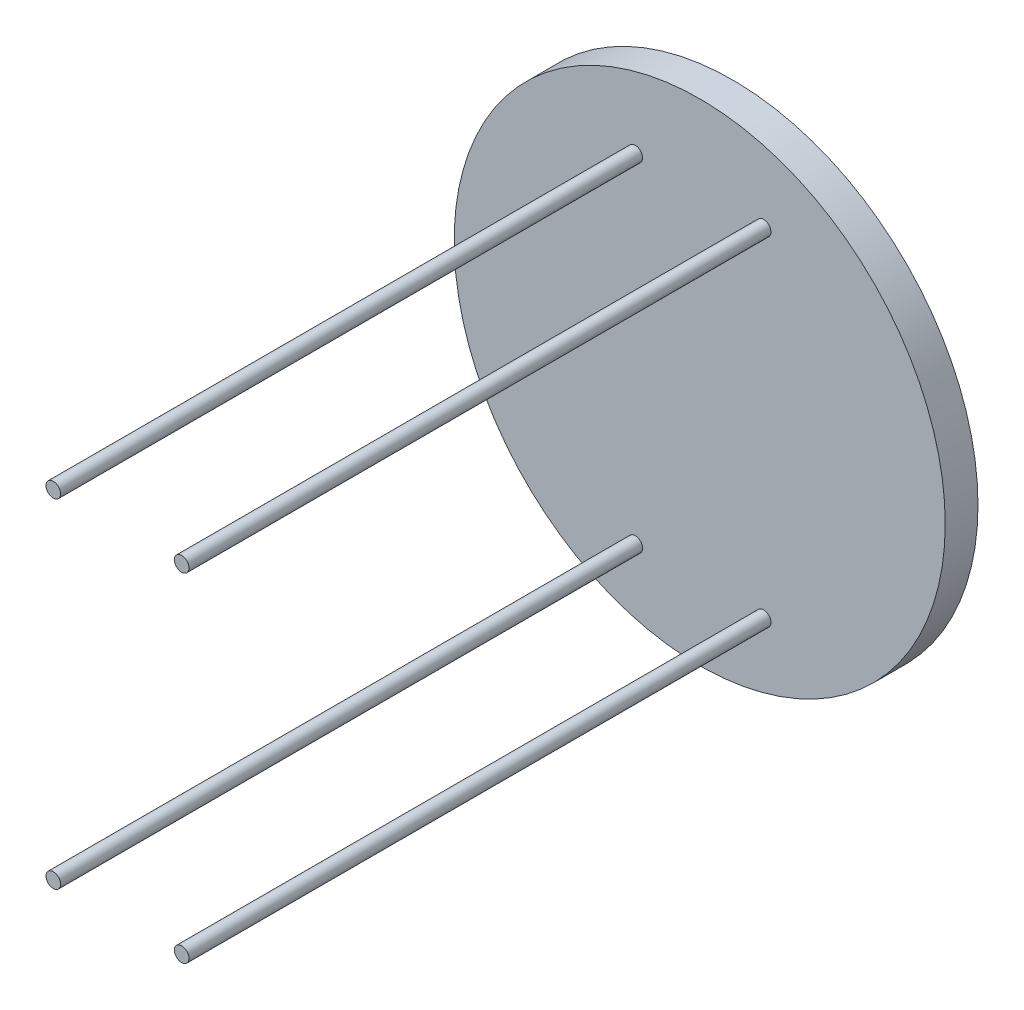
ISO-10303-21;
HEADER;
FILE_DESCRIPTION(('STEP AP214'),'2;1');
FILE_NAME('part.step','',(''),(''),'','','');
FILE_SCHEMA(('AUTOMOTIVE_DESIGN { 1 0 10303 214 1 1 1 1 }'));
ENDSEC;
DATA;
#1=APPLICATION_CONTEXT('core data for automotive mechanical design processes');
#2=APPLICATION_PROTOCOL_DEFINITION('international standard','automotive_design',2000,#1);
#3=PRODUCT_CONTEXT('',#1,'mechanical');
#4=PRODUCT('Part','Part','',(#3));
#5=PRODUCT_RELATED_PRODUCT_CATEGORY('part','',(#4));
#6=PRODUCT_DEFINITION_FORMATION('','',#4);
#7=PRODUCT_DEFINITION_CONTEXT('part definition',#1,'design');
#8=PRODUCT_DEFINITION('design','',#6,#7);
#9=PRODUCT_DEFINITION_SHAPE('','',#8);
#10=(LENGTH_UNIT() NAMED_UNIT(*) SI_UNIT(.MILLI.,.METRE.));
#11=(NAMED_UNIT(*) PLANE_ANGLE_UNIT() SI_UNIT($,.RADIAN.));
#12=(NAMED_UNIT(*) SI_UNIT($,.STERADIAN.) SOLID_ANGLE_UNIT());
#13=UNCERTAINTY_MEASURE_WITH_UNIT(LENGTH_MEASURE(1.E-05),#10,'distance_accuracy_value','');
#14=(GEOMETRIC_REPRESENTATION_CONTEXT(3) GLOBAL_UNCERTAINTY_ASSIGNED_CONTEXT((#13)) GLOBAL_UNIT_ASSIGNED_CONTEXT((#10,
#11,#12)) REPRESENTATION_CONTEXT('',''));
#15=CARTESIAN_POINT('',(0.,0.,0.));
#16=DIRECTION('',(0.,0.,1.));
#17=DIRECTION('',(1.,0.,0.));
#18=AXIS2_PLACEMENT_3D('',#15,#16,#17);
#19=CARTESIAN_POINT('',(833.930631375601,-1197.16637306014,769.51077616825));
#20=DIRECTION('',(0.,0.,1.));
#21=DIRECTION('',(1.,0.,0.));
#22=AXIS2_PLACEMENT_3D('',#19,#20,#21);
#23=CYLINDRICAL_SURFACE('',#22,1304.09277986268);
#24=CARTESIAN_POINT('',(833.930631375601,-1197.16637306014,769.51077616825));
#25=DIRECTION('',(0.,0.,1.));
#26=DIRECTION('',(1.,0.,0.));
#27=AXIS2_PLACEMENT_3D('',#24,#25,#26);
#28=CIRCLE('',#27,1304.09277986268);
#29=CARTESIAN_POINT('',(2138.02341123828,-1197.16637306014,769.51077616825));
#30=VERTEX_POINT('',#29);
#31=EDGE_CURVE('E12',#30,#30,#28,.T.);
#32=ORIENTED_EDGE('',*,*,#31,.T.);
#33=EDGE_LOOP('',(#32));
#34=FACE_BOUND('',#33,.T.);
#35=CARTESIAN_POINT('',(833.930631375601,-1197.16637306014,943.51077616825));
#36=DIRECTION('',(0.,0.,1.));
#37=DIRECTION('',(1.,0.,0.));
#38=AXIS2_PLACEMENT_3D('',#35,#36,#37);
#39=CIRCLE('',#38,1304.09277986268);
#40=CARTESIAN_POINT('',(2138.02341123828,-1197.16637306014,943.51077616825));
#41=VERTEX_POINT('',#40);
#42=EDGE_CURVE('E54',#41,#41,#39,.T.);
#43=ORIENTED_EDGE('',*,*,#42,.F.);
#44=EDGE_LOOP('',(#43));
#45=FACE_BOUND('',#44,.T.);
#46=ADVANCED_FACE('F51',(#34,#45),#23,.T.);
#47=CARTESIAN_POINT('',(833.930631375601,-1197.16637306014,769.51077616825));
#48=DIRECTION('',(0.,0.,1.));
#49=DIRECTION('',(1.,0.,0.));
#50=AXIS2_PLACEMENT_3D('',#47,#48,#49);
#51=PLANE('',#50);
#52=ORIENTED_EDGE('',*,*,#31,.F.);
#53=EDGE_LOOP('',(#52));
#54=FACE_BOUND('',#53,.T.);
#55=ADVANCED_FACE('F100',(#54),#51,.F.);
#56=CARTESIAN_POINT('',(833.930631375601,-1197.16637306014,943.51077616825));
#57=DIRECTION('',(0.,0.,1.));
#58=DIRECTION('',(1.,0.,0.));
#59=AXIS2_PLACEMENT_3D('',#56,#57,#58);
#60=PLANE('',#59);
#61=CARTESIAN_POINT('',(1173.63922552686,-2112.86084923489,943.51077616825));
#62=DIRECTION('',(0.,0.,1.));
#63=DIRECTION('',(1.,0.,0.));
#64=AXIS2_PLACEMENT_3D('',#61,#62,#63);
#65=CIRCLE('',#64,38.7717149999999);
#66=CARTESIAN_POINT('',(1212.41094052686,-2112.86084923489,943.51077616825));
#67=VERTEX_POINT('',#66);
#68=EDGE_CURVE('E81',#67,#67,#65,.T.);
#69=ORIENTED_EDGE('',*,*,#68,.F.);
#70=EDGE_LOOP('',(#69));
#71=FACE_BOUND('',#70,.T.);
#72=CARTESIAN_POINT('',(491.765116757733,-2112.86084923489,943.51077616825));
#73=DIRECTION('',(0.,0.,1.));
#74=DIRECTION('',(1.,0.,0.));
#75=AXIS2_PLACEMENT_3D('',#72,#73,#74);
#76=CIRCLE('',#75,38.771715);
#77=CARTESIAN_POINT('',(530.536831757733,-2112.86084923489,943.51077616825));
#78=VERTEX_POINT('',#77);
#79=EDGE_CURVE('E75',#78,#78,#76,.T.);
#80=ORIENTED_EDGE('',*,*,#79,.F.);
#81=EDGE_LOOP('',(#80));
#82=FACE_BOUND('',#81,.T.);
#83=CARTESIAN_POINT('',(491.765116757733,-317.201613393006,943.51077616825));
#84=DIRECTION('',(0.,0.,1.));
#85=DIRECTION('',(1.,0.,0.));
#86=AXIS2_PLACEMENT_3D('',#83,#84,#85);
#87=CIRCLE('',#86,38.771715);
#88=CARTESIAN_POINT('',(530.536831757733,-317.201613393006,943.51077616825));
#89=VERTEX_POINT('',#88);
#90=EDGE_CURVE('E69',#89,#89,#87,.T.);
#91=ORIENTED_EDGE('',*,*,#90,.F.);
#92=EDGE_LOOP('',(#91));
#93=FACE_BOUND('',#92,.T.);
#94=CARTESIAN_POINT('',(1173.63922552686,-317.201613393006,943.51077616825));
#95=DIRECTION('',(0.,0.,1.));
#96=DIRECTION('',(1.,0.,0.));
#97=AXIS2_PLACEMENT_3D('',#94,#95,#96);
#98=CIRCLE('',#97,38.7717152851179);
#99=CARTESIAN_POINT('',(1212.41094081198,-317.201613393006,943.51077616825));
#100=VERTEX_POINT('',#99);
#101=EDGE_CURVE('E63',#100,#100,#98,.T.);
#102=ORIENTED_EDGE('',*,*,#101,.F.);
#103=EDGE_LOOP('',(#102));
#104=FACE_BOUND('',#103,.T.);
#105=ORIENTED_EDGE('',*,*,#42,.T.);
#106=EDGE_LOOP('',(#105));
#107=FACE_BOUND('',#106,.T.);
#108=ADVANCED_FACE('F96',(#71,#82,#93,#104,#107),#60,.T.);
#109=CARTESIAN_POINT('',(1173.63922552686,-317.201613393006,4034.51077616825));
#110=DIRECTION('',(0.,0.,-1.));
#111=DIRECTION('',(-1.,0.,0.));
#112=AXIS2_PLACEMENT_3D('',#109,#110,#111);
#113=CYLINDRICAL_SURFACE('',#112,38.7717152851179);
#114=CARTESIAN_POINT('',(1173.63922552686,-317.201613393006,4034.51077616825));
#115=DIRECTION('',(0.,0.,1.));
#116=DIRECTION('',(1.,0.,0.));
#117=AXIS2_PLACEMENT_3D('',#114,#115,#116);
#118=CIRCLE('',#117,38.7717152851179);
#119=CARTESIAN_POINT('',(1212.41094081198,-317.201613393006,4034.51077616825));
#120=VERTEX_POINT('',#119);
#121=EDGE_CURVE('E61',#120,#120,#118,.T.);
#122=ORIENTED_EDGE('',*,*,#121,.F.);
#123=EDGE_LOOP('',(#122));
#124=FACE_BOUND('',#123,.T.);
#125=ORIENTED_EDGE('',*,*,#101,.T.);
#126=EDGE_LOOP('',(#125));
#127=FACE_BOUND('',#126,.T.);
#128=ADVANCED_FACE('F99',(#124,#127),#113,.T.);
#129=CARTESIAN_POINT('',(1173.63922552686,-317.201613393006,4034.51077616825));
#130=DIRECTION('',(0.,0.,1.));
#131=DIRECTION('',(1.,0.,0.));
#132=AXIS2_PLACEMENT_3D('',#129,#130,#131);
#133=PLANE('',#132);
#134=ORIENTED_EDGE('',*,*,#121,.T.);
#135=EDGE_LOOP('',(#134));
#136=FACE_BOUND('',#135,.T.);
#137=ADVANCED_FACE('F120',(#136),#133,.T.);
#138=CARTESIAN_POINT('',(491.765116757733,-317.201613393006,4034.51077616825));
#139=DIRECTION('',(0.,0.,-1.));
#140=DIRECTION('',(-1.,0.,0.));
#141=AXIS2_PLACEMENT_3D('',#138,#139,#140);
#142=CYLINDRICAL_SURFACE('',#141,38.771715);
#143=CARTESIAN_POINT('',(491.765116757733,-317.201613393006,4034.51077616825));
#144=DIRECTION('',(0.,0.,1.));
#145=DIRECTION('',(1.,0.,0.));
#146=AXIS2_PLACEMENT_3D('',#143,#144,#145);
#147=CIRCLE('',#146,38.771715);
#148=CARTESIAN_POINT('',(530.536831757733,-317.201613393006,4034.51077616825));
#149=VERTEX_POINT('',#148);
#150=EDGE_CURVE('E66',#149,#149,#147,.T.);
#151=ORIENTED_EDGE('',*,*,#150,.F.);
#152=EDGE_LOOP('',(#151));
#153=FACE_BOUND('',#152,.T.);
#154=ORIENTED_EDGE('',*,*,#90,.T.);
#155=EDGE_LOOP('',(#154));
#156=FACE_BOUND('',#155,.T.);
#157=ADVANCED_FACE('F124',(#153,#156),#142,.T.);
#158=CARTESIAN_POINT('',(491.765116757733,-317.201613393006,4034.51077616825));
#159=DIRECTION('',(0.,0.,1.));
#160=DIRECTION('',(1.,0.,0.));
#161=AXIS2_PLACEMENT_3D('',#158,#159,#160);
#162=PLANE('',#161);
#163=ORIENTED_EDGE('',*,*,#150,.T.);
#164=EDGE_LOOP('',(#163));
#165=FACE_BOUND('',#164,.T.);
#166=ADVANCED_FACE('F128',(#165),#162,.T.);
#167=CARTESIAN_POINT('',(491.765116757733,-2112.86084923489,4034.51077616825));
#168=DIRECTION('',(0.,0.,-1.));
#169=DIRECTION('',(-1.,0.,0.));
#170=AXIS2_PLACEMENT_3D('',#167,#168,#169);
#171=CYLINDRICAL_SURFACE('',#170,38.771715);
#172=CARTESIAN_POINT('',(491.765116757733,-2112.86084923489,4034.51077616825));
#173=DIRECTION('',(0.,0.,1.));
#174=DIRECTION('',(1.,0.,0.));
#175=AXIS2_PLACEMENT_3D('',#172,#173,#174);
#176=CIRCLE('',#175,38.771715);
#177=CARTESIAN_POINT('',(530.536831757733,-2112.86084923489,4034.51077616825));
#178=VERTEX_POINT('',#177);
#179=EDGE_CURVE('E72',#178,#178,#176,.T.);
#180=ORIENTED_EDGE('',*,*,#179,.F.);
#181=EDGE_LOOP('',(#180));
#182=FACE_BOUND('',#181,.T.);
#183=ORIENTED_EDGE('',*,*,#79,.T.);
#184=EDGE_LOOP('',(#183));
#185=FACE_BOUND('',#184,.T.);
#186=ADVANCED_FACE('F132',(#182,#185),#171,.T.);
#187=CARTESIAN_POINT('',(491.765116757733,-2112.86084923489,4034.51077616825));
#188=DIRECTION('',(0.,0.,1.));
#189=DIRECTION('',(1.,0.,0.));
#190=AXIS2_PLACEMENT_3D('',#187,#188,#189);
#191=PLANE('',#190);
#192=ORIENTED_EDGE('',*,*,#179,.T.);
#193=EDGE_LOOP('',(#192));
#194=FACE_BOUND('',#193,.T.);
#195=ADVANCED_FACE('F92',(#194),#191,.T.);
#196=CARTESIAN_POINT('',(1173.63922552686,-2112.86084923489,4034.51077616825));
#197=DIRECTION('',(0.,0.,-1.));
#198=DIRECTION('',(-1.,0.,0.));
#199=AXIS2_PLACEMENT_3D('',#196,#197,#198);
#200=CYLINDRICAL_SURFACE('',#199,38.7717149999999);
#201=CARTESIAN_POINT('',(1173.63922552686,-2112.86084923489,4034.51077616825));
#202=DIRECTION('',(0.,0.,1.));
#203=DIRECTION('',(1.,0.,0.));
#204=AXIS2_PLACEMENT_3D('',#201,#202,#203);
#205=CIRCLE('',#204,38.7717149999999);
#206=CARTESIAN_POINT('',(1212.41094052686,-2112.86084923489,4034.51077616825));
#207=VERTEX_POINT('',#206);
#208=EDGE_CURVE('E78',#207,#207,#205,.T.);
#209=ORIENTED_EDGE('',*,*,#208,.F.);
#210=EDGE_LOOP('',(#209));
#211=FACE_BOUND('',#210,.T.);
#212=ORIENTED_EDGE('',*,*,#68,.T.);
#213=EDGE_LOOP('',(#212));
#214=FACE_BOUND('',#213,.T.);
#215=ADVANCED_FACE('F89',(#211,#214),#200,.T.);
#216=CARTESIAN_POINT('',(1173.63922552686,-2112.86084923489,4034.51077616825));
#217=DIRECTION('',(0.,0.,1.));
#218=DIRECTION('',(1.,0.,0.));
#219=AXIS2_PLACEMENT_3D('',#216,#217,#218);
#220=PLANE('',#219);
#221=ORIENTED_EDGE('',*,*,#208,.T.);
#222=EDGE_LOOP('',(#221));
#223=FACE_BOUND('',#222,.T.);
#224=ADVANCED_FACE('F87',(#223),#220,.T.);
#225=CLOSED_SHELL('',(#46,#55,#108,#128,#137,#157,#166,#186,#195,#215,#224));
#226=MANIFOLD_SOLID_BREP('B2',#225);
#227=ADVANCED_BREP_SHAPE_REPRESENTATION('',(#18,#226),#14);
#228=SHAPE_DEFINITION_REPRESENTATION(#9,#227);
ENDSEC;
END-ISO-10303-21;
